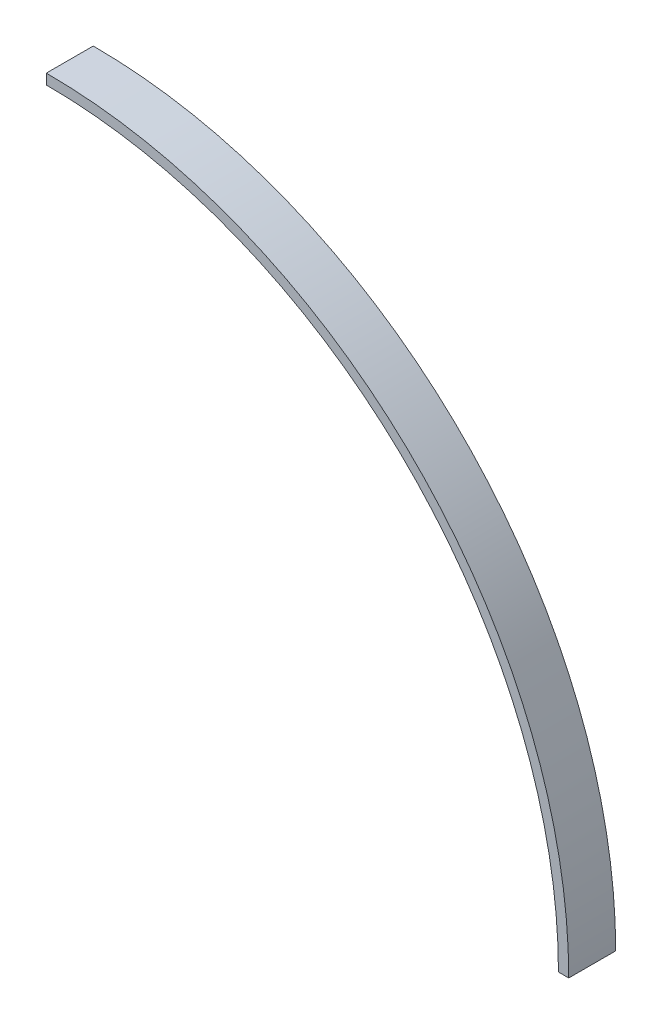
ISO-10303-21;
HEADER;
FILE_DESCRIPTION(('STEP AP214'),'2;1');
FILE_NAME('part.step','',(''),(''),'','','');
FILE_SCHEMA(('AUTOMOTIVE_DESIGN { 1 0 10303 214 1 1 1 1 }'));
ENDSEC;
DATA;
#1=APPLICATION_CONTEXT('core data for automotive mechanical design processes');
#2=APPLICATION_PROTOCOL_DEFINITION('international standard','automotive_design',2000,#1);
#3=PRODUCT_CONTEXT('',#1,'mechanical');
#4=PRODUCT('Part','Part','',(#3));
#5=PRODUCT_RELATED_PRODUCT_CATEGORY('part','',(#4));
#6=PRODUCT_DEFINITION_FORMATION('','',#4);
#7=PRODUCT_DEFINITION_CONTEXT('part definition',#1,'design');
#8=PRODUCT_DEFINITION('design','',#6,#7);
#9=PRODUCT_DEFINITION_SHAPE('','',#8);
#10=(LENGTH_UNIT() NAMED_UNIT(*) SI_UNIT(.MILLI.,.METRE.));
#11=(NAMED_UNIT(*) PLANE_ANGLE_UNIT() SI_UNIT($,.RADIAN.));
#12=(NAMED_UNIT(*) SI_UNIT($,.STERADIAN.) SOLID_ANGLE_UNIT());
#13=UNCERTAINTY_MEASURE_WITH_UNIT(LENGTH_MEASURE(1.E-05),#10,'distance_accuracy_value','');
#14=(GEOMETRIC_REPRESENTATION_CONTEXT(3) GLOBAL_UNCERTAINTY_ASSIGNED_CONTEXT((#13)) GLOBAL_UNIT_ASSIGNED_CONTEXT((#10,
#11,#12)) REPRESENTATION_CONTEXT('',''));
#15=CARTESIAN_POINT('',(0.,0.,0.));
#16=DIRECTION('',(0.,0.,1.));
#17=DIRECTION('',(1.,0.,0.));
#18=AXIS2_PLACEMENT_3D('',#15,#16,#17);
#19=CARTESIAN_POINT('',(0.,0.,0.));
#20=DIRECTION('',(0.,0.,1.));
#21=DIRECTION('',(1.,0.,0.));
#22=AXIS2_PLACEMENT_3D('',#19,#20,#21);
#23=PLANE('',#22);
#24=CARTESIAN_POINT('',(0.,0.,0.));
#25=DIRECTION('',(0.,0.,1.));
#26=DIRECTION('',(1.,0.,0.));
#27=AXIS2_PLACEMENT_3D('',#24,#25,#26);
#28=CIRCLE('',#27,248.75);
#29=CARTESIAN_POINT('',(248.75,0.,0.));
#30=VERTEX_POINT('',#29);
#31=CARTESIAN_POINT('',(0.,248.75,0.));
#32=VERTEX_POINT('',#31);
#33=EDGE_CURVE('E135',#30,#32,#28,.T.);
#34=ORIENTED_EDGE('',*,*,#33,.T.);
#35=DIRECTION('',(0.,1.,0.));
#36=VECTOR('',#35,1.);
#37=CARTESIAN_POINT('',(0.,0.,0.));
#38=LINE('',#37,#36);
#39=CARTESIAN_POINT('',(0.,250.5,0.));
#40=VERTEX_POINT('',#39);
#41=EDGE_CURVE('E116',#32,#40,#38,.T.);
#42=ORIENTED_EDGE('',*,*,#41,.T.);
#43=CARTESIAN_POINT('',(0.,0.,0.));
#44=DIRECTION('',(0.,0.,1.));
#45=DIRECTION('',(1.,0.,0.));
#46=AXIS2_PLACEMENT_3D('',#43,#44,#45);
#47=CIRCLE('',#46,250.5);
#48=CARTESIAN_POINT('',(250.5,0.,0.));
#49=VERTEX_POINT('',#48);
#50=EDGE_CURVE('E104',#49,#40,#47,.T.);
#51=ORIENTED_EDGE('',*,*,#50,.F.);
#52=DIRECTION('',(-1.,0.,0.));
#53=VECTOR('',#52,1.);
#54=CARTESIAN_POINT('',(0.,0.,0.));
#55=LINE('',#54,#53);
#56=EDGE_CURVE('E97',#49,#30,#55,.T.);
#57=ORIENTED_EDGE('',*,*,#56,.T.);
#58=EDGE_LOOP('',(#34,#42,#51,#57));
#59=FACE_BOUND('',#58,.T.);
#60=ADVANCED_FACE('F35',(#59),#23,.F.);
#61=CARTESIAN_POINT('',(0.,0.,735.977848998413));
#62=DIRECTION('',(0.,0.,-1.));
#63=DIRECTION('',(-1.,0.,0.));
#64=AXIS2_PLACEMENT_3D('',#61,#62,#63);
#65=CYLINDRICAL_SURFACE('',#64,248.75);
#66=DIRECTION('',(0.,0.,-1.));
#67=VECTOR('',#66,1.);
#68=CARTESIAN_POINT('',(0.,248.75,735.977848998413));
#69=LINE('',#68,#67);
#70=CARTESIAN_POINT('',(0.,248.75,21.8));
#71=VERTEX_POINT('',#70);
#72=EDGE_CURVE('E49',#32,#71,#69,.F.);
#73=ORIENTED_EDGE('',*,*,#72,.F.);
#74=ORIENTED_EDGE('',*,*,#33,.F.);
#75=DIRECTION('',(0.,0.,-1.));
#76=VECTOR('',#75,1.);
#77=CARTESIAN_POINT('',(248.75,0.,735.977848998413));
#78=LINE('',#77,#76);
#79=CARTESIAN_POINT('',(248.75,0.,21.8));
#80=VERTEX_POINT('',#79);
#81=EDGE_CURVE('E126',#80,#30,#78,.T.);
#82=ORIENTED_EDGE('',*,*,#81,.F.);
#83=CARTESIAN_POINT('',(0.,0.,21.8));
#84=DIRECTION('',(0.,0.,1.));
#85=DIRECTION('',(1.,0.,0.));
#86=AXIS2_PLACEMENT_3D('',#83,#84,#85);
#87=CIRCLE('',#86,248.75);
#88=EDGE_CURVE('E133',#80,#71,#87,.T.);
#89=ORIENTED_EDGE('',*,*,#88,.T.);
#90=EDGE_LOOP('',(#73,#74,#82,#89));
#91=FACE_BOUND('',#90,.T.);
#92=ADVANCED_FACE('F142',(#91),#65,.F.);
#93=CARTESIAN_POINT('',(0.,0.,21.8));
#94=DIRECTION('',(0.,0.,1.));
#95=DIRECTION('',(0.740185682275545,0.672402525095114,0.));
#96=AXIS2_PLACEMENT_3D('',#93,#94,#95);
#97=PLANE('',#96);
#98=DIRECTION('',(0.,1.,0.));
#99=VECTOR('',#98,1.);
#100=CARTESIAN_POINT('',(0.,0.,21.8));
#101=LINE('',#100,#99);
#102=CARTESIAN_POINT('',(0.,253.75,21.8));
#103=VERTEX_POINT('',#102);
#104=EDGE_CURVE('E57',#71,#103,#101,.T.);
#105=ORIENTED_EDGE('',*,*,#104,.F.);
#106=ORIENTED_EDGE('',*,*,#88,.F.);
#107=DIRECTION('',(-1.,0.,0.));
#108=VECTOR('',#107,1.);
#109=CARTESIAN_POINT('',(0.,0.,21.8));
#110=LINE('',#109,#108);
#111=CARTESIAN_POINT('',(253.75,0.,21.8));
#112=VERTEX_POINT('',#111);
#113=EDGE_CURVE('E123',#112,#80,#110,.T.);
#114=ORIENTED_EDGE('',*,*,#113,.F.);
#115=CARTESIAN_POINT('',(0.,0.,21.8));
#116=DIRECTION('',(0.,0.,1.));
#117=DIRECTION('',(1.,0.,0.));
#118=AXIS2_PLACEMENT_3D('',#115,#116,#117);
#119=CIRCLE('',#118,253.75);
#120=EDGE_CURVE('E131',#103,#112,#119,.F.);
#121=ORIENTED_EDGE('',*,*,#120,.F.);
#122=EDGE_LOOP('',(#105,#106,#114,#121));
#123=FACE_BOUND('',#122,.T.);
#124=ADVANCED_FACE('F144',(#123),#97,.T.);
#125=CARTESIAN_POINT('',(0.,0.,739.513382904346));
#126=DIRECTION('',(0.,0.,-1.));
#127=DIRECTION('',(-1.,0.,0.));
#128=AXIS2_PLACEMENT_3D('',#125,#126,#127);
#129=CYLINDRICAL_SURFACE('',#128,250.5);
#130=ORIENTED_EDGE('',*,*,#50,.T.);
#131=DIRECTION('',(0.,0.,-1.));
#132=VECTOR('',#131,1.);
#133=CARTESIAN_POINT('',(0.,250.5,739.513382904346));
#134=LINE('',#133,#132);
#135=CARTESIAN_POINT('',(0.,250.5,-1.));
#136=VERTEX_POINT('',#135);
#137=EDGE_CURVE('E101',#40,#136,#134,.T.);
#138=ORIENTED_EDGE('',*,*,#137,.T.);
#139=CARTESIAN_POINT('',(0.,0.,-1.));
#140=DIRECTION('',(0.,0.,-1.));
#141=DIRECTION('',(-1.,0.,0.));
#142=AXIS2_PLACEMENT_3D('',#139,#140,#141);
#143=CIRCLE('',#142,250.5);
#144=CARTESIAN_POINT('',(250.5,0.,-1.));
#145=VERTEX_POINT('',#144);
#146=EDGE_CURVE('E89',#136,#145,#143,.T.);
#147=ORIENTED_EDGE('',*,*,#146,.T.);
#148=DIRECTION('',(0.,0.,-1.));
#149=VECTOR('',#148,1.);
#150=CARTESIAN_POINT('',(250.5,0.,739.513382904346));
#151=LINE('',#150,#149);
#152=EDGE_CURVE('E121',#145,#49,#151,.F.);
#153=ORIENTED_EDGE('',*,*,#152,.T.);
#154=EDGE_LOOP('',(#130,#138,#147,#153));
#155=FACE_BOUND('',#154,.T.);
#156=ADVANCED_FACE('F102',(#155),#129,.F.);
#157=CARTESIAN_POINT('',(0.,0.,739.513382904346));
#158=DIRECTION('',(0.,0.,-1.));
#159=DIRECTION('',(-1.,0.,0.));
#160=AXIS2_PLACEMENT_3D('',#157,#158,#159);
#161=CYLINDRICAL_SURFACE('',#160,253.75);
#162=DIRECTION('',(0.,0.,-1.));
#163=VECTOR('',#162,1.);
#164=CARTESIAN_POINT('',(0.,253.75,739.513382904346));
#165=LINE('',#164,#163);
#166=CARTESIAN_POINT('',(0.,253.75,-1.));
#167=VERTEX_POINT('',#166);
#168=EDGE_CURVE('E107',#103,#167,#165,.T.);
#169=ORIENTED_EDGE('',*,*,#168,.F.);
#170=ORIENTED_EDGE('',*,*,#120,.T.);
#171=DIRECTION('',(0.,0.,-1.));
#172=VECTOR('',#171,1.);
#173=CARTESIAN_POINT('',(253.75,0.,739.513382904346));
#174=LINE('',#173,#172);
#175=CARTESIAN_POINT('',(253.75,0.,-1.));
#176=VERTEX_POINT('',#175);
#177=EDGE_CURVE('E118',#176,#112,#174,.F.);
#178=ORIENTED_EDGE('',*,*,#177,.F.);
#179=CARTESIAN_POINT('',(0.,0.,-1.));
#180=DIRECTION('',(0.,0.,-1.));
#181=DIRECTION('',(-1.,0.,0.));
#182=AXIS2_PLACEMENT_3D('',#179,#180,#181);
#183=CIRCLE('',#182,253.75);
#184=EDGE_CURVE('E96',#167,#176,#183,.T.);
#185=ORIENTED_EDGE('',*,*,#184,.F.);
#186=EDGE_LOOP('',(#169,#170,#178,#185));
#187=FACE_BOUND('',#186,.T.);
#188=ADVANCED_FACE('F145',(#187),#161,.T.);
#189=CARTESIAN_POINT('',(0.,0.,-1.));
#190=DIRECTION('',(0.,0.,-1.));
#191=DIRECTION('',(-1.,0.,0.));
#192=AXIS2_PLACEMENT_3D('',#189,#190,#191);
#193=PLANE('',#192);
#194=DIRECTION('',(0.,-1.,0.));
#195=VECTOR('',#194,1.);
#196=CARTESIAN_POINT('',(0.,0.,-1.));
#197=LINE('',#196,#195);
#198=EDGE_CURVE('E12',#167,#136,#197,.T.);
#199=ORIENTED_EDGE('',*,*,#198,.F.);
#200=ORIENTED_EDGE('',*,*,#184,.T.);
#201=DIRECTION('',(1.,0.,0.));
#202=VECTOR('',#201,1.);
#203=CARTESIAN_POINT('',(0.,0.,-1.));
#204=LINE('',#203,#202);
#205=EDGE_CURVE('E42',#145,#176,#204,.T.);
#206=ORIENTED_EDGE('',*,*,#205,.F.);
#207=ORIENTED_EDGE('',*,*,#146,.F.);
#208=EDGE_LOOP('',(#199,#200,#206,#207));
#209=FACE_BOUND('',#208,.T.);
#210=ADVANCED_FACE('F91',(#209),#193,.T.);
#211=CARTESIAN_POINT('',(0.,0.,0.));
#212=DIRECTION('',(0.,1.,0.));
#213=DIRECTION('',(0.,0.,1.));
#214=AXIS2_PLACEMENT_3D('',#211,#212,#213);
#215=PLANE('',#214);
#216=ORIENTED_EDGE('',*,*,#56,.F.);
#217=ORIENTED_EDGE('',*,*,#152,.F.);
#218=ORIENTED_EDGE('',*,*,#205,.T.);
#219=ORIENTED_EDGE('',*,*,#177,.T.);
#220=ORIENTED_EDGE('',*,*,#113,.T.);
#221=ORIENTED_EDGE('',*,*,#81,.T.);
#222=EDGE_LOOP('',(#216,#217,#218,#219,#220,#221));
#223=FACE_BOUND('',#222,.T.);
#224=ADVANCED_FACE('F139',(#223),#215,.F.);
#225=CARTESIAN_POINT('',(0.,0.,0.));
#226=DIRECTION('',(1.,0.,0.));
#227=DIRECTION('',(0.,0.,-1.));
#228=AXIS2_PLACEMENT_3D('',#225,#226,#227);
#229=PLANE('',#228);
#230=ORIENTED_EDGE('',*,*,#41,.F.);
#231=ORIENTED_EDGE('',*,*,#72,.T.);
#232=ORIENTED_EDGE('',*,*,#104,.T.);
#233=ORIENTED_EDGE('',*,*,#168,.T.);
#234=ORIENTED_EDGE('',*,*,#198,.T.);
#235=ORIENTED_EDGE('',*,*,#137,.F.);
#236=EDGE_LOOP('',(#230,#231,#232,#233,#234,#235));
#237=FACE_BOUND('',#236,.T.);
#238=ADVANCED_FACE('F110',(#237),#229,.F.);
#239=CLOSED_SHELL('',(#60,#92,#124,#156,#188,#210,#224,#238));
#240=MANIFOLD_SOLID_BREP('B2',#239);
#241=ADVANCED_BREP_SHAPE_REPRESENTATION('',(#18,#240),#14);
#242=SHAPE_DEFINITION_REPRESENTATION(#9,#241);
ENDSEC;
END-ISO-10303-21;
